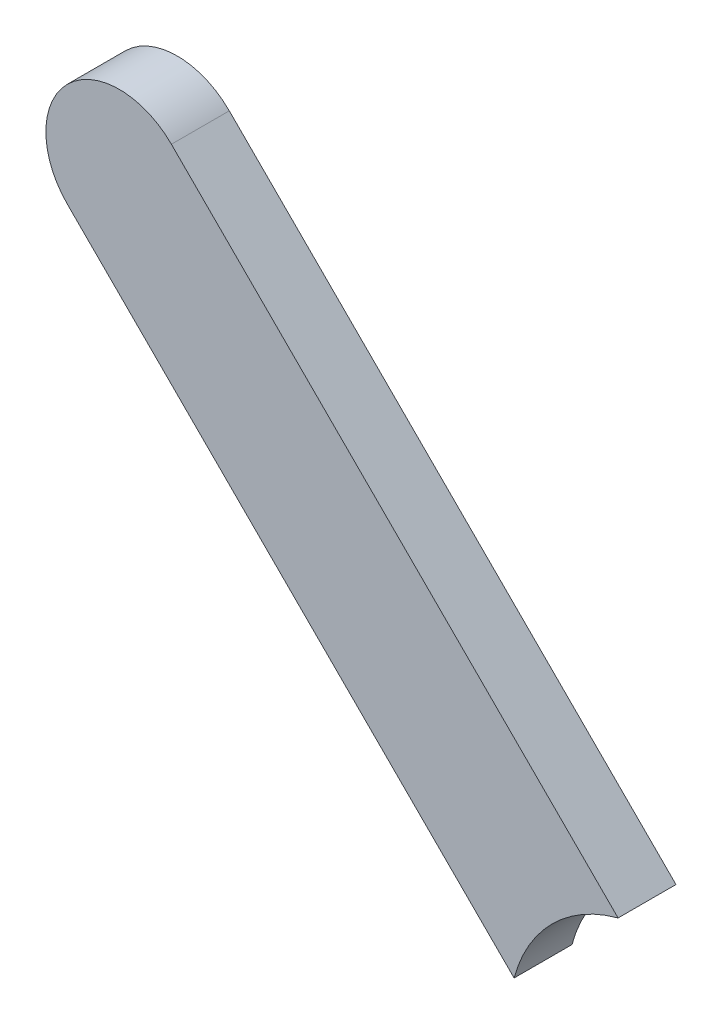
ISO-10303-21;
HEADER;
FILE_DESCRIPTION(('STEP AP214'),'2;1');
FILE_NAME('part.step','',(''),(''),'','','');
FILE_SCHEMA(('AUTOMOTIVE_DESIGN { 1 0 10303 214 1 1 1 1 }'));
ENDSEC;
DATA;
#1=APPLICATION_CONTEXT('core data for automotive mechanical design processes');
#2=APPLICATION_PROTOCOL_DEFINITION('international standard','automotive_design',2000,#1);
#3=PRODUCT_CONTEXT('',#1,'mechanical');
#4=PRODUCT('Part','Part','',(#3));
#5=PRODUCT_RELATED_PRODUCT_CATEGORY('part','',(#4));
#6=PRODUCT_DEFINITION_FORMATION('','',#4);
#7=PRODUCT_DEFINITION_CONTEXT('part definition',#1,'design');
#8=PRODUCT_DEFINITION('design','',#6,#7);
#9=PRODUCT_DEFINITION_SHAPE('','',#8);
#10=(LENGTH_UNIT() NAMED_UNIT(*) SI_UNIT(.MILLI.,.METRE.));
#11=(NAMED_UNIT(*) PLANE_ANGLE_UNIT() SI_UNIT($,.RADIAN.));
#12=(NAMED_UNIT(*) SI_UNIT($,.STERADIAN.) SOLID_ANGLE_UNIT());
#13=UNCERTAINTY_MEASURE_WITH_UNIT(LENGTH_MEASURE(1.E-05),#10,'distance_accuracy_value','');
#14=(GEOMETRIC_REPRESENTATION_CONTEXT(3) GLOBAL_UNCERTAINTY_ASSIGNED_CONTEXT((#13)) GLOBAL_UNIT_ASSIGNED_CONTEXT((#10,
#11,#12)) REPRESENTATION_CONTEXT('',''));
#15=CARTESIAN_POINT('',(0.,0.,0.));
#16=DIRECTION('',(0.,0.,1.));
#17=DIRECTION('',(1.,0.,0.));
#18=AXIS2_PLACEMENT_3D('',#15,#16,#17);
#19=CARTESIAN_POINT('',(150.74719406,119.65759406,0.));
#20=DIRECTION('',(0.707106781186548,0.707106781186548,0.));
#21=DIRECTION('',(0.707106781186548,-0.707106781186548,0.));
#22=AXIS2_PLACEMENT_3D('',#19,#20,#21);
#23=PLANE('',#22);
#24=DIRECTION('',(0.707106781186548,-0.707106781186548,0.));
#25=VECTOR('',#24,1.);
#26=CARTESIAN_POINT('',(150.74719406,119.65759406,0.1999996));
#27=LINE('',#26,#25);
#28=CARTESIAN_POINT('',(150.74719406,119.65759406,0.1999996));
#29=VERTEX_POINT('',#28);
#30=CARTESIAN_POINT('',(152.290309334697,118.114478785303,0.1999996));
#31=VERTEX_POINT('',#30);
#32=EDGE_CURVE('E11',#29,#31,#27,.T.);
#33=ORIENTED_EDGE('',*,*,#32,.F.);
#34=DIRECTION('',(0.,0.,1.));
#35=VECTOR('',#34,1.);
#36=CARTESIAN_POINT('',(150.74719406,119.65759406,0.));
#37=LINE('',#36,#35);
#38=CARTESIAN_POINT('',(150.74719406,119.65759406,0.));
#39=VERTEX_POINT('',#38);
#40=EDGE_CURVE('E24',#39,#29,#37,.T.);
#41=ORIENTED_EDGE('',*,*,#40,.F.);
#42=DIRECTION('',(0.707106781186548,-0.707106781186548,0.));
#43=VECTOR('',#42,1.);
#44=CARTESIAN_POINT('',(150.74719406,119.65759406,0.));
#45=LINE('',#44,#43);
#46=CARTESIAN_POINT('',(152.290309334697,118.114478785303,0.));
#47=VERTEX_POINT('',#46);
#48=EDGE_CURVE('E75',#39,#47,#45,.T.);
#49=ORIENTED_EDGE('',*,*,#48,.T.);
#50=DIRECTION('',(0.,0.,1.));
#51=VECTOR('',#50,1.);
#52=CARTESIAN_POINT('',(152.290309334697,118.114478785303,0.));
#53=LINE('',#52,#51);
#54=EDGE_CURVE('E37',#47,#31,#53,.T.);
#55=ORIENTED_EDGE('',*,*,#54,.T.);
#56=EDGE_LOOP('',(#33,#41,#49,#55));
#57=FACE_BOUND('',#56,.T.);
#58=ADVANCED_FACE('F17',(#57),#23,.F.);
#59=CARTESIAN_POINT('',(152.781,117.983,0.));
#60=DIRECTION('',(0.,0.,-1.));
#61=DIRECTION('',(1.,0.,0.));
#62=AXIS2_PLACEMENT_3D('',#59,#60,#61);
#63=CYLINDRICAL_SURFACE('',#62,0.508);
#64=DIRECTION('',(0.,0.,1.));
#65=VECTOR('',#64,1.);
#66=CARTESIAN_POINT('',(152.649521214697,118.473690665303,0.));
#67=LINE('',#66,#65);
#68=CARTESIAN_POINT('',(152.649521214697,118.473690665303,0.));
#69=VERTEX_POINT('',#68);
#70=CARTESIAN_POINT('',(152.649521214697,118.473690665303,0.1999996));
#71=VERTEX_POINT('',#70);
#72=EDGE_CURVE('E67',#69,#71,#67,.T.);
#73=ORIENTED_EDGE('',*,*,#72,.T.);
#74=CARTESIAN_POINT('',(152.781,117.983,0.1999996));
#75=DIRECTION('',(0.,0.,1.));
#76=DIRECTION('',(1.,0.,0.));
#77=AXIS2_PLACEMENT_3D('',#74,#75,#76);
#78=CIRCLE('',#77,0.508);
#79=EDGE_CURVE('E82',#71,#31,#78,.T.);
#80=ORIENTED_EDGE('',*,*,#79,.T.);
#81=ORIENTED_EDGE('',*,*,#54,.F.);
#82=CARTESIAN_POINT('',(152.781,117.983,0.));
#83=DIRECTION('',(0.,0.,1.));
#84=DIRECTION('',(1.,0.,0.));
#85=AXIS2_PLACEMENT_3D('',#82,#83,#84);
#86=CIRCLE('',#85,0.508);
#87=EDGE_CURVE('E80',#69,#47,#86,.T.);
#88=ORIENTED_EDGE('',*,*,#87,.F.);
#89=EDGE_LOOP('',(#73,#80,#81,#88));
#90=FACE_BOUND('',#89,.T.);
#91=ADVANCED_FACE('F88',(#90),#63,.F.);
#92=CARTESIAN_POINT('',(152.649521214697,118.473690665303,0.));
#93=DIRECTION('',(-0.70710678118655,-0.707106781186545,0.));
#94=DIRECTION('',(-0.707106781186545,0.70710678118655,0.));
#95=AXIS2_PLACEMENT_3D('',#92,#93,#94);
#96=PLANE('',#95);
#97=DIRECTION('',(-0.707106781186545,0.70710678118655,0.));
#98=VECTOR('',#97,1.);
#99=CARTESIAN_POINT('',(152.96060594,118.16260594,0.1999996));
#100=LINE('',#99,#98);
#101=CARTESIAN_POINT('',(151.10640594,120.01680594,0.1999996));
#102=VERTEX_POINT('',#101);
#103=EDGE_CURVE('E71',#71,#102,#100,.T.);
#104=ORIENTED_EDGE('',*,*,#103,.F.);
#105=ORIENTED_EDGE('',*,*,#72,.F.);
#106=DIRECTION('',(-0.707106781186545,0.70710678118655,0.));
#107=VECTOR('',#106,1.);
#108=CARTESIAN_POINT('',(152.96060594,118.16260594,0.));
#109=LINE('',#108,#107);
#110=CARTESIAN_POINT('',(151.10640594,120.01680594,0.));
#111=VERTEX_POINT('',#110);
#112=EDGE_CURVE('E63',#69,#111,#109,.T.);
#113=ORIENTED_EDGE('',*,*,#112,.T.);
#114=DIRECTION('',(0.,0.,1.));
#115=VECTOR('',#114,1.);
#116=CARTESIAN_POINT('',(151.10640594,120.01680594,0.));
#117=LINE('',#116,#115);
#118=EDGE_CURVE('E53',#111,#102,#117,.T.);
#119=ORIENTED_EDGE('',*,*,#118,.T.);
#120=EDGE_LOOP('',(#104,#105,#113,#119));
#121=FACE_BOUND('',#120,.T.);
#122=ADVANCED_FACE('F66',(#121),#96,.F.);
#123=CARTESIAN_POINT('',(150.9268,119.8372,0.));
#124=DIRECTION('',(0.,0.,-1.));
#125=DIRECTION('',(0.70710678118652,0.707106781186576,0.));
#126=AXIS2_PLACEMENT_3D('',#123,#124,#125);
#127=CYLINDRICAL_SURFACE('',#126,0.254001156230778);
#128=CARTESIAN_POINT('',(150.9268,119.8372,0.1999996));
#129=DIRECTION('',(0.,0.,1.));
#130=DIRECTION('',(0.70710678118652,0.707106781186576,0.));
#131=AXIS2_PLACEMENT_3D('',#128,#129,#130);
#132=CIRCLE('',#131,0.254001156230778);
#133=EDGE_CURVE('E59',#102,#29,#132,.T.);
#134=ORIENTED_EDGE('',*,*,#133,.F.);
#135=ORIENTED_EDGE('',*,*,#118,.F.);
#136=CARTESIAN_POINT('',(150.9268,119.8372,0.));
#137=DIRECTION('',(0.,0.,1.));
#138=DIRECTION('',(0.70710678118652,0.707106781186576,0.));
#139=AXIS2_PLACEMENT_3D('',#136,#137,#138);
#140=CIRCLE('',#139,0.254001156230778);
#141=EDGE_CURVE('E57',#111,#39,#140,.T.);
#142=ORIENTED_EDGE('',*,*,#141,.T.);
#143=ORIENTED_EDGE('',*,*,#40,.T.);
#144=EDGE_LOOP('',(#134,#135,#142,#143));
#145=FACE_BOUND('',#144,.T.);
#146=ADVANCED_FACE('F55',(#145),#127,.T.);
#147=CARTESIAN_POINT('',(150.74719406,119.65759406,0.));
#148=DIRECTION('',(0.,0.,-1.));
#149=DIRECTION('',(-1.,0.,0.));
#150=AXIS2_PLACEMENT_3D('',#147,#148,#149);
#151=PLANE('',#150);
#152=ORIENTED_EDGE('',*,*,#48,.F.);
#153=ORIENTED_EDGE('',*,*,#141,.F.);
#154=ORIENTED_EDGE('',*,*,#112,.F.);
#155=ORIENTED_EDGE('',*,*,#87,.T.);
#156=EDGE_LOOP('',(#152,#153,#154,#155));
#157=FACE_BOUND('',#156,.T.);
#158=ADVANCED_FACE('F74',(#157),#151,.T.);
#159=CARTESIAN_POINT('',(150.74719406,119.65759406,0.1999996));
#160=DIRECTION('',(0.,0.,-1.));
#161=DIRECTION('',(-1.,0.,0.));
#162=AXIS2_PLACEMENT_3D('',#159,#160,#161);
#163=PLANE('',#162);
#164=ORIENTED_EDGE('',*,*,#133,.T.);
#165=ORIENTED_EDGE('',*,*,#32,.T.);
#166=ORIENTED_EDGE('',*,*,#79,.F.);
#167=ORIENTED_EDGE('',*,*,#103,.T.);
#168=EDGE_LOOP('',(#164,#165,#166,#167));
#169=FACE_BOUND('',#168,.T.);
#170=ADVANCED_FACE('F91',(#169),#163,.F.);
#171=CLOSED_SHELL('',(#58,#91,#122,#146,#158,#170));
#172=MANIFOLD_SOLID_BREP('B1',#171);
#173=ADVANCED_BREP_SHAPE_REPRESENTATION('',(#18,#172),#14);
#174=SHAPE_DEFINITION_REPRESENTATION(#9,#173);
ENDSEC;
END-ISO-10303-21;
